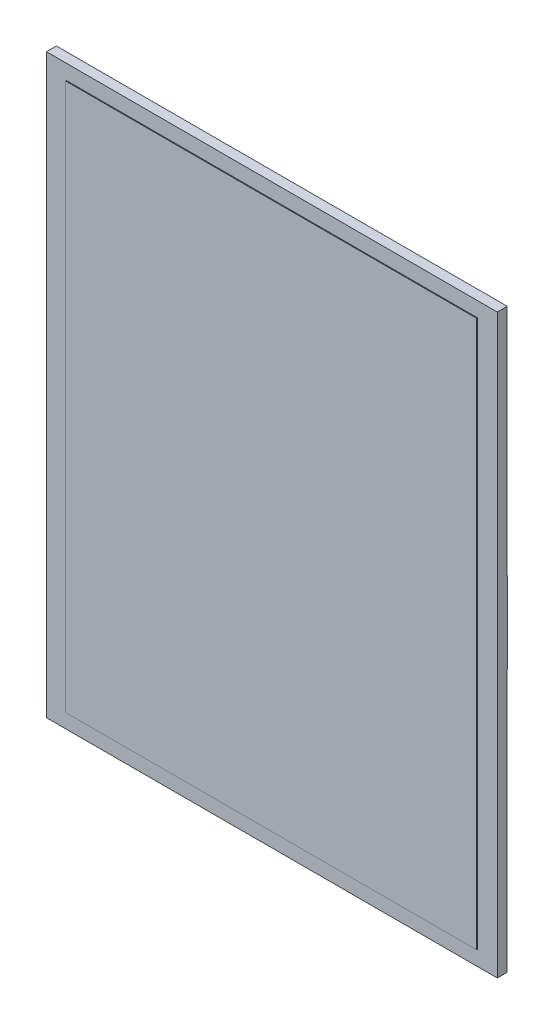
ISO-10303-21;
HEADER;
FILE_DESCRIPTION(('STEP AP214'),'2;1');
FILE_NAME('part.step','',(''),(''),'','','');
FILE_SCHEMA(('AUTOMOTIVE_DESIGN { 1 0 10303 214 1 1 1 1 }'));
ENDSEC;
DATA;
#1=APPLICATION_CONTEXT('core data for automotive mechanical design processes');
#2=APPLICATION_PROTOCOL_DEFINITION('international standard','automotive_design',2000,#1);
#3=PRODUCT_CONTEXT('',#1,'mechanical');
#4=PRODUCT('Part','Part','',(#3));
#5=PRODUCT_RELATED_PRODUCT_CATEGORY('part','',(#4));
#6=PRODUCT_DEFINITION_FORMATION('','',#4);
#7=PRODUCT_DEFINITION_CONTEXT('part definition',#1,'design');
#8=PRODUCT_DEFINITION('design','',#6,#7);
#9=PRODUCT_DEFINITION_SHAPE('','',#8);
#10=(LENGTH_UNIT() NAMED_UNIT(*) SI_UNIT(.MILLI.,.METRE.));
#11=(NAMED_UNIT(*) PLANE_ANGLE_UNIT() SI_UNIT($,.RADIAN.));
#12=(NAMED_UNIT(*) SI_UNIT($,.STERADIAN.) SOLID_ANGLE_UNIT());
#13=UNCERTAINTY_MEASURE_WITH_UNIT(LENGTH_MEASURE(1.E-05),#10,'distance_accuracy_value','');
#14=(GEOMETRIC_REPRESENTATION_CONTEXT(3) GLOBAL_UNCERTAINTY_ASSIGNED_CONTEXT((#13)) GLOBAL_UNIT_ASSIGNED_CONTEXT((#10,
#11,#12)) REPRESENTATION_CONTEXT('',''));
#15=CARTESIAN_POINT('',(0.,0.,0.));
#16=DIRECTION('',(0.,0.,1.));
#17=DIRECTION('',(1.,0.,0.));
#18=AXIS2_PLACEMENT_3D('',#15,#16,#17);
#19=CARTESIAN_POINT('',(0.,0.,3.));
#20=DIRECTION('',(0.,0.,-1.));
#21=DIRECTION('',(-1.,0.,0.));
#22=AXIS2_PLACEMENT_3D('',#19,#20,#21);
#23=PLANE('',#22);
#24=DIRECTION('',(0.,-1.,0.));
#25=VECTOR('',#24,1.);
#26=CARTESIAN_POINT('',(-68.,-87.,3.));
#27=LINE('',#26,#25);
#28=CARTESIAN_POINT('',(-68.,87.,3.));
#29=VERTEX_POINT('',#28);
#30=CARTESIAN_POINT('',(-68.,-87.,3.));
#31=VERTEX_POINT('',#30);
#32=EDGE_CURVE('E184',#29,#31,#27,.T.);
#33=ORIENTED_EDGE('',*,*,#32,.T.);
#34=DIRECTION('',(1.,0.,0.));
#35=VECTOR('',#34,1.);
#36=CARTESIAN_POINT('',(-68.,-87.,3.));
#37=LINE('',#36,#35);
#38=CARTESIAN_POINT('',(68.,-87.,3.));
#39=VERTEX_POINT('',#38);
#40=EDGE_CURVE('E187',#31,#39,#37,.T.);
#41=ORIENTED_EDGE('',*,*,#40,.T.);
#42=DIRECTION('',(0.,1.,0.));
#43=VECTOR('',#42,1.);
#44=CARTESIAN_POINT('',(68.,-87.,3.));
#45=LINE('',#44,#43);
#46=CARTESIAN_POINT('',(68.,87.,3.));
#47=VERTEX_POINT('',#46);
#48=EDGE_CURVE('E190',#39,#47,#45,.T.);
#49=ORIENTED_EDGE('',*,*,#48,.T.);
#50=DIRECTION('',(-1.,0.,0.));
#51=VECTOR('',#50,1.);
#52=CARTESIAN_POINT('',(-68.,87.,3.));
#53=LINE('',#52,#51);
#54=EDGE_CURVE('E192',#47,#29,#53,.T.);
#55=ORIENTED_EDGE('',*,*,#54,.T.);
#56=EDGE_LOOP('',(#33,#41,#49,#55));
#57=FACE_BOUND('',#56,.T.);
#58=DIRECTION('',(0.,-1.,0.));
#59=VECTOR('',#58,1.);
#60=CARTESIAN_POINT('',(-62.,-82.5,3.));
#61=LINE('',#60,#59);
#62=CARTESIAN_POINT('',(-62.,82.5,3.));
#63=VERTEX_POINT('',#62);
#64=CARTESIAN_POINT('',(-62.,-82.5,3.));
#65=VERTEX_POINT('',#64);
#66=EDGE_CURVE('E145',#63,#65,#61,.T.);
#67=ORIENTED_EDGE('',*,*,#66,.F.);
#68=DIRECTION('',(-1.,0.,0.));
#69=VECTOR('',#68,1.);
#70=CARTESIAN_POINT('',(-62.,82.5,3.));
#71=LINE('',#70,#69);
#72=CARTESIAN_POINT('',(62.,82.5,3.));
#73=VERTEX_POINT('',#72);
#74=EDGE_CURVE('E158',#73,#63,#71,.T.);
#75=ORIENTED_EDGE('',*,*,#74,.F.);
#76=DIRECTION('',(0.,1.,0.));
#77=VECTOR('',#76,1.);
#78=CARTESIAN_POINT('',(62.,-82.5,3.));
#79=LINE('',#78,#77);
#80=CARTESIAN_POINT('',(62.,-82.5,3.));
#81=VERTEX_POINT('',#80);
#82=EDGE_CURVE('E167',#81,#73,#79,.T.);
#83=ORIENTED_EDGE('',*,*,#82,.F.);
#84=DIRECTION('',(1.,0.,0.));
#85=VECTOR('',#84,1.);
#86=CARTESIAN_POINT('',(-62.,-82.5,3.));
#87=LINE('',#86,#85);
#88=EDGE_CURVE('E148',#65,#81,#87,.T.);
#89=ORIENTED_EDGE('',*,*,#88,.F.);
#90=EDGE_LOOP('',(#67,#75,#83,#89));
#91=FACE_BOUND('',#90,.T.);
#92=ADVANCED_FACE('F35',(#57,#91),#23,.F.);
#93=CARTESIAN_POINT('',(-68.,-87.,3.));
#94=DIRECTION('',(1.,0.,0.));
#95=DIRECTION('',(0.,0.,-1.));
#96=AXIS2_PLACEMENT_3D('',#93,#94,#95);
#97=PLANE('',#96);
#98=DIRECTION('',(0.,-1.,0.));
#99=VECTOR('',#98,1.);
#100=CARTESIAN_POINT('',(-68.,-87.,0.));
#101=LINE('',#100,#99);
#102=CARTESIAN_POINT('',(-68.,87.,0.));
#103=VERTEX_POINT('',#102);
#104=CARTESIAN_POINT('',(-68.,-87.,0.));
#105=VERTEX_POINT('',#104);
#106=EDGE_CURVE('E183',#103,#105,#101,.T.);
#107=ORIENTED_EDGE('',*,*,#106,.T.);
#108=DIRECTION('',(0.,0.,-1.));
#109=VECTOR('',#108,1.);
#110=CARTESIAN_POINT('',(-68.,-87.,3.));
#111=LINE('',#110,#109);
#112=EDGE_CURVE('E11',#31,#105,#111,.T.);
#113=ORIENTED_EDGE('',*,*,#112,.F.);
#114=ORIENTED_EDGE('',*,*,#32,.F.);
#115=DIRECTION('',(0.,0.,-1.));
#116=VECTOR('',#115,1.);
#117=CARTESIAN_POINT('',(-68.,87.,3.));
#118=LINE('',#117,#116);
#119=EDGE_CURVE('E194',#29,#103,#118,.T.);
#120=ORIENTED_EDGE('',*,*,#119,.T.);
#121=EDGE_LOOP('',(#107,#113,#114,#120));
#122=FACE_BOUND('',#121,.T.);
#123=ADVANCED_FACE('F37',(#122),#97,.F.);
#124=CARTESIAN_POINT('',(-68.,-87.,3.));
#125=DIRECTION('',(0.,1.,0.));
#126=DIRECTION('',(-1.,0.,0.));
#127=AXIS2_PLACEMENT_3D('',#124,#125,#126);
#128=PLANE('',#127);
#129=DIRECTION('',(1.,0.,0.));
#130=VECTOR('',#129,1.);
#131=CARTESIAN_POINT('',(-68.,-87.,0.));
#132=LINE('',#131,#130);
#133=CARTESIAN_POINT('',(68.,-87.,0.));
#134=VERTEX_POINT('',#133);
#135=EDGE_CURVE('E197',#105,#134,#132,.T.);
#136=ORIENTED_EDGE('',*,*,#135,.T.);
#137=DIRECTION('',(0.,0.,-1.));
#138=VECTOR('',#137,1.);
#139=CARTESIAN_POINT('',(68.,-87.,3.));
#140=LINE('',#139,#138);
#141=EDGE_CURVE('E43',#39,#134,#140,.T.);
#142=ORIENTED_EDGE('',*,*,#141,.F.);
#143=ORIENTED_EDGE('',*,*,#40,.F.);
#144=ORIENTED_EDGE('',*,*,#112,.T.);
#145=EDGE_LOOP('',(#136,#142,#143,#144));
#146=FACE_BOUND('',#145,.T.);
#147=ADVANCED_FACE('F244',(#146),#128,.F.);
#148=CARTESIAN_POINT('',(68.,-87.,3.));
#149=DIRECTION('',(-1.,0.,0.));
#150=DIRECTION('',(0.,-1.,0.));
#151=AXIS2_PLACEMENT_3D('',#148,#149,#150);
#152=PLANE('',#151);
#153=DIRECTION('',(0.,1.,0.));
#154=VECTOR('',#153,1.);
#155=CARTESIAN_POINT('',(68.,-87.,0.));
#156=LINE('',#155,#154);
#157=CARTESIAN_POINT('',(68.,-7.91722371205239,0.));
#158=VERTEX_POINT('',#157);
#159=EDGE_CURVE('E199',#134,#158,#156,.T.);
#160=ORIENTED_EDGE('',*,*,#159,.T.);
#161=DIRECTION('',(0.,0.,1.));
#162=VECTOR('',#161,1.);
#163=CARTESIAN_POINT('',(68.,-7.91722371205239,-0.1));
#164=LINE('',#163,#162);
#165=CARTESIAN_POINT('',(68.,-7.91722371205239,-0.1));
#166=VERTEX_POINT('',#165);
#167=EDGE_CURVE('E129',#166,#158,#164,.T.);
#168=ORIENTED_EDGE('',*,*,#167,.F.);
#169=DIRECTION('',(0.,-1.,0.));
#170=VECTOR('',#169,1.);
#171=CARTESIAN_POINT('',(68.,16.5832560277543,-0.1));
#172=LINE('',#171,#170);
#173=CARTESIAN_POINT('',(68.,16.5832560277543,-0.1));
#174=VERTEX_POINT('',#173);
#175=EDGE_CURVE('E122',#174,#166,#172,.T.);
#176=ORIENTED_EDGE('',*,*,#175,.F.);
#177=DIRECTION('',(0.,0.,1.));
#178=VECTOR('',#177,1.);
#179=CARTESIAN_POINT('',(68.,16.5832560277543,-0.1));
#180=LINE('',#179,#178);
#181=CARTESIAN_POINT('',(68.,16.5832560277543,0.));
#182=VERTEX_POINT('',#181);
#183=EDGE_CURVE('E127',#174,#182,#180,.T.);
#184=ORIENTED_EDGE('',*,*,#183,.T.);
#185=CARTESIAN_POINT('',(68.,87.,0.));
#186=VERTEX_POINT('',#185);
#187=EDGE_CURVE('E55',#182,#186,#156,.T.);
#188=ORIENTED_EDGE('',*,*,#187,.T.);
#189=DIRECTION('',(0.,0.,-1.));
#190=VECTOR('',#189,1.);
#191=CARTESIAN_POINT('',(68.,87.,3.));
#192=LINE('',#191,#190);
#193=EDGE_CURVE('E204',#47,#186,#192,.T.);
#194=ORIENTED_EDGE('',*,*,#193,.F.);
#195=ORIENTED_EDGE('',*,*,#48,.F.);
#196=ORIENTED_EDGE('',*,*,#141,.T.);
#197=EDGE_LOOP('',(#160,#168,#176,#184,#188,#194,#195,#196));
#198=FACE_BOUND('',#197,.T.);
#199=ADVANCED_FACE('F125',(#198),#152,.F.);
#200=CARTESIAN_POINT('',(-68.,87.,3.));
#201=DIRECTION('',(0.,-1.,0.));
#202=DIRECTION('',(0.,0.,-1.));
#203=AXIS2_PLACEMENT_3D('',#200,#201,#202);
#204=PLANE('',#203);
#205=DIRECTION('',(-1.,0.,0.));
#206=VECTOR('',#205,1.);
#207=CARTESIAN_POINT('',(-68.,87.,0.));
#208=LINE('',#207,#206);
#209=EDGE_CURVE('E188',#186,#103,#208,.T.);
#210=ORIENTED_EDGE('',*,*,#209,.T.);
#211=ORIENTED_EDGE('',*,*,#119,.F.);
#212=ORIENTED_EDGE('',*,*,#54,.F.);
#213=ORIENTED_EDGE('',*,*,#193,.T.);
#214=EDGE_LOOP('',(#210,#211,#212,#213));
#215=FACE_BOUND('',#214,.T.);
#216=ADVANCED_FACE('F253',(#215),#204,.F.);
#217=CARTESIAN_POINT('',(0.,0.,0.));
#218=DIRECTION('',(0.,0.,-1.));
#219=DIRECTION('',(-1.,0.,0.));
#220=AXIS2_PLACEMENT_3D('',#217,#218,#219);
#221=PLANE('',#220);
#222=DIRECTION('',(1.,0.,0.));
#223=VECTOR('',#222,1.);
#224=CARTESIAN_POINT('',(68.,16.5832560277543,0.));
#225=LINE('',#224,#223);
#226=CARTESIAN_POINT('',(49.8446174767082,16.5832560277543,0.));
#227=VERTEX_POINT('',#226);
#228=EDGE_CURVE('E50',#227,#182,#225,.T.);
#229=ORIENTED_EDGE('',*,*,#228,.F.);
#230=DIRECTION('',(0.,1.,0.));
#231=VECTOR('',#230,1.);
#232=CARTESIAN_POINT('',(49.8446174767082,16.5832560277543,0.));
#233=LINE('',#232,#231);
#234=CARTESIAN_POINT('',(49.8446174767082,-7.91722371205239,0.));
#235=VERTEX_POINT('',#234);
#236=EDGE_CURVE('E142',#235,#227,#233,.T.);
#237=ORIENTED_EDGE('',*,*,#236,.F.);
#238=DIRECTION('',(-1.,0.,0.));
#239=VECTOR('',#238,1.);
#240=CARTESIAN_POINT('',(68.,-7.91722371205239,0.));
#241=LINE('',#240,#239);
#242=EDGE_CURVE('E215',#158,#235,#241,.T.);
#243=ORIENTED_EDGE('',*,*,#242,.F.);
#244=ORIENTED_EDGE('',*,*,#159,.F.);
#245=ORIENTED_EDGE('',*,*,#135,.F.);
#246=ORIENTED_EDGE('',*,*,#106,.F.);
#247=ORIENTED_EDGE('',*,*,#209,.F.);
#248=ORIENTED_EDGE('',*,*,#187,.F.);
#249=EDGE_LOOP('',(#229,#237,#243,#244,#245,#246,#247,#248));
#250=FACE_BOUND('',#249,.T.);
#251=ADVANCED_FACE('F212',(#250),#221,.T.);
#252=CARTESIAN_POINT('',(-62.,-82.5,3.25));
#253=DIRECTION('',(1.,0.,0.));
#254=DIRECTION('',(0.,1.,0.));
#255=AXIS2_PLACEMENT_3D('',#252,#253,#254);
#256=PLANE('',#255);
#257=ORIENTED_EDGE('',*,*,#66,.T.);
#258=DIRECTION('',(0.,0.,-1.));
#259=VECTOR('',#258,1.);
#260=CARTESIAN_POINT('',(-62.,-82.5,3.25));
#261=LINE('',#260,#259);
#262=CARTESIAN_POINT('',(-62.,-82.5,3.25));
#263=VERTEX_POINT('',#262);
#264=EDGE_CURVE('E180',#263,#65,#261,.T.);
#265=ORIENTED_EDGE('',*,*,#264,.F.);
#266=DIRECTION('',(0.,-1.,0.));
#267=VECTOR('',#266,1.);
#268=CARTESIAN_POINT('',(-62.,-82.5,3.25));
#269=LINE('',#268,#267);
#270=CARTESIAN_POINT('',(-62.,82.5,3.25));
#271=VERTEX_POINT('',#270);
#272=EDGE_CURVE('E154',#271,#263,#269,.T.);
#273=ORIENTED_EDGE('',*,*,#272,.F.);
#274=DIRECTION('',(0.,0.,-1.));
#275=VECTOR('',#274,1.);
#276=CARTESIAN_POINT('',(-62.,82.5,3.25));
#277=LINE('',#276,#275);
#278=EDGE_CURVE('E163',#271,#63,#277,.T.);
#279=ORIENTED_EDGE('',*,*,#278,.T.);
#280=EDGE_LOOP('',(#257,#265,#273,#279));
#281=FACE_BOUND('',#280,.T.);
#282=ADVANCED_FACE('F249',(#281),#256,.F.);
#283=CARTESIAN_POINT('',(-62.,-82.5,3.25));
#284=DIRECTION('',(0.,1.,0.));
#285=DIRECTION('',(0.,0.,1.));
#286=AXIS2_PLACEMENT_3D('',#283,#284,#285);
#287=PLANE('',#286);
#288=ORIENTED_EDGE('',*,*,#88,.T.);
#289=DIRECTION('',(0.,0.,-1.));
#290=VECTOR('',#289,1.);
#291=CARTESIAN_POINT('',(62.,-82.5,3.25));
#292=LINE('',#291,#290);
#293=CARTESIAN_POINT('',(62.,-82.5,3.25));
#294=VERTEX_POINT('',#293);
#295=EDGE_CURVE('E177',#294,#81,#292,.T.);
#296=ORIENTED_EDGE('',*,*,#295,.F.);
#297=DIRECTION('',(1.,0.,0.));
#298=VECTOR('',#297,1.);
#299=CARTESIAN_POINT('',(-62.,-82.5,3.25));
#300=LINE('',#299,#298);
#301=EDGE_CURVE('E157',#263,#294,#300,.T.);
#302=ORIENTED_EDGE('',*,*,#301,.F.);
#303=ORIENTED_EDGE('',*,*,#264,.T.);
#304=EDGE_LOOP('',(#288,#296,#302,#303));
#305=FACE_BOUND('',#304,.T.);
#306=ADVANCED_FACE('F286',(#305),#287,.F.);
#307=CARTESIAN_POINT('',(62.,-82.5,3.25));
#308=DIRECTION('',(-1.,0.,0.));
#309=DIRECTION('',(0.,-1.,0.));
#310=AXIS2_PLACEMENT_3D('',#307,#308,#309);
#311=PLANE('',#310);
#312=ORIENTED_EDGE('',*,*,#82,.T.);
#313=DIRECTION('',(0.,0.,-1.));
#314=VECTOR('',#313,1.);
#315=CARTESIAN_POINT('',(62.,82.5,3.25));
#316=LINE('',#315,#314);
#317=CARTESIAN_POINT('',(62.,82.5,3.25));
#318=VERTEX_POINT('',#317);
#319=EDGE_CURVE('E174',#318,#73,#316,.T.);
#320=ORIENTED_EDGE('',*,*,#319,.F.);
#321=DIRECTION('',(0.,1.,0.));
#322=VECTOR('',#321,1.);
#323=CARTESIAN_POINT('',(62.,-82.5,3.25));
#324=LINE('',#323,#322);
#325=EDGE_CURVE('E160',#294,#318,#324,.T.);
#326=ORIENTED_EDGE('',*,*,#325,.F.);
#327=ORIENTED_EDGE('',*,*,#295,.T.);
#328=EDGE_LOOP('',(#312,#320,#326,#327));
#329=FACE_BOUND('',#328,.T.);
#330=ADVANCED_FACE('F293',(#329),#311,.F.);
#331=CARTESIAN_POINT('',(-62.,82.5,3.25));
#332=DIRECTION('',(0.,-1.,0.));
#333=DIRECTION('',(1.,0.,0.));
#334=AXIS2_PLACEMENT_3D('',#331,#332,#333);
#335=PLANE('',#334);
#336=ORIENTED_EDGE('',*,*,#74,.T.);
#337=ORIENTED_EDGE('',*,*,#278,.F.);
#338=DIRECTION('',(-1.,0.,0.));
#339=VECTOR('',#338,1.);
#340=CARTESIAN_POINT('',(-62.,82.5,3.25));
#341=LINE('',#340,#339);
#342=EDGE_CURVE('E162',#318,#271,#341,.T.);
#343=ORIENTED_EDGE('',*,*,#342,.F.);
#344=ORIENTED_EDGE('',*,*,#319,.T.);
#345=EDGE_LOOP('',(#336,#337,#343,#344));
#346=FACE_BOUND('',#345,.T.);
#347=ADVANCED_FACE('F300',(#346),#335,.F.);
#348=CARTESIAN_POINT('',(0.,0.,3.25));
#349=DIRECTION('',(0.,0.,-1.));
#350=DIRECTION('',(-1.,0.,0.));
#351=AXIS2_PLACEMENT_3D('',#348,#349,#350);
#352=PLANE('',#351);
#353=ORIENTED_EDGE('',*,*,#272,.T.);
#354=ORIENTED_EDGE('',*,*,#301,.T.);
#355=ORIENTED_EDGE('',*,*,#325,.T.);
#356=ORIENTED_EDGE('',*,*,#342,.T.);
#357=EDGE_LOOP('',(#353,#354,#355,#356));
#358=FACE_BOUND('',#357,.T.);
#359=ADVANCED_FACE('F236',(#358),#352,.F.);
#360=CARTESIAN_POINT('',(68.,16.5832560277543,-0.1));
#361=DIRECTION('',(0.,-1.,0.));
#362=DIRECTION('',(0.,0.,-1.));
#363=AXIS2_PLACEMENT_3D('',#360,#361,#362);
#364=PLANE('',#363);
#365=ORIENTED_EDGE('',*,*,#228,.T.);
#366=ORIENTED_EDGE('',*,*,#183,.F.);
#367=DIRECTION('',(1.,0.,0.));
#368=VECTOR('',#367,1.);
#369=CARTESIAN_POINT('',(68.,16.5832560277543,-0.1));
#370=LINE('',#369,#368);
#371=CARTESIAN_POINT('',(49.8446174767082,16.5832560277543,-0.1));
#372=VERTEX_POINT('',#371);
#373=EDGE_CURVE('E133',#372,#174,#370,.T.);
#374=ORIENTED_EDGE('',*,*,#373,.F.);
#375=DIRECTION('',(0.,0.,1.));
#376=VECTOR('',#375,1.);
#377=CARTESIAN_POINT('',(49.8446174767082,16.5832560277543,-0.1));
#378=LINE('',#377,#376);
#379=EDGE_CURVE('E224',#372,#227,#378,.T.);
#380=ORIENTED_EDGE('',*,*,#379,.T.);
#381=EDGE_LOOP('',(#365,#366,#374,#380));
#382=FACE_BOUND('',#381,.T.);
#383=ADVANCED_FACE('F144',(#382),#364,.F.);
#384=CARTESIAN_POINT('',(68.,-7.91722371205239,-0.1));
#385=DIRECTION('',(0.,1.,0.));
#386=DIRECTION('',(0.,0.,1.));
#387=AXIS2_PLACEMENT_3D('',#384,#385,#386);
#388=PLANE('',#387);
#389=ORIENTED_EDGE('',*,*,#242,.T.);
#390=DIRECTION('',(0.,0.,1.));
#391=VECTOR('',#390,1.);
#392=CARTESIAN_POINT('',(49.8446174767082,-7.91722371205239,-0.1));
#393=LINE('',#392,#391);
#394=CARTESIAN_POINT('',(49.8446174767082,-7.91722371205239,-0.1));
#395=VERTEX_POINT('',#394);
#396=EDGE_CURVE('E150',#395,#235,#393,.T.);
#397=ORIENTED_EDGE('',*,*,#396,.F.);
#398=DIRECTION('',(-1.,0.,0.));
#399=VECTOR('',#398,1.);
#400=CARTESIAN_POINT('',(68.,-7.91722371205239,-0.1));
#401=LINE('',#400,#399);
#402=EDGE_CURVE('E132',#166,#395,#401,.T.);
#403=ORIENTED_EDGE('',*,*,#402,.F.);
#404=ORIENTED_EDGE('',*,*,#167,.T.);
#405=EDGE_LOOP('',(#389,#397,#403,#404));
#406=FACE_BOUND('',#405,.T.);
#407=ADVANCED_FACE('F227',(#406),#388,.F.);
#408=CARTESIAN_POINT('',(49.8446174767082,16.5832560277543,-0.1));
#409=DIRECTION('',(1.,0.,0.));
#410=DIRECTION('',(0.,1.,0.));
#411=AXIS2_PLACEMENT_3D('',#408,#409,#410);
#412=PLANE('',#411);
#413=ORIENTED_EDGE('',*,*,#236,.T.);
#414=ORIENTED_EDGE('',*,*,#379,.F.);
#415=DIRECTION('',(0.,1.,0.));
#416=VECTOR('',#415,1.);
#417=CARTESIAN_POINT('',(49.8446174767082,16.5832560277543,-0.1));
#418=LINE('',#417,#416);
#419=EDGE_CURVE('E138',#395,#372,#418,.T.);
#420=ORIENTED_EDGE('',*,*,#419,.F.);
#421=ORIENTED_EDGE('',*,*,#396,.T.);
#422=EDGE_LOOP('',(#413,#414,#420,#421));
#423=FACE_BOUND('',#422,.T.);
#424=ADVANCED_FACE('F226',(#423),#412,.F.);
#425=CARTESIAN_POINT('',(0.,0.,-0.1));
#426=DIRECTION('',(0.,0.,1.));
#427=DIRECTION('',(1.,0.,0.));
#428=AXIS2_PLACEMENT_3D('',#425,#426,#427);
#429=PLANE('',#428);
#430=ORIENTED_EDGE('',*,*,#373,.T.);
#431=ORIENTED_EDGE('',*,*,#175,.T.);
#432=ORIENTED_EDGE('',*,*,#402,.T.);
#433=ORIENTED_EDGE('',*,*,#419,.T.);
#434=EDGE_LOOP('',(#430,#431,#432,#433));
#435=FACE_BOUND('',#434,.T.);
#436=ADVANCED_FACE('F136',(#435),#429,.F.);
#437=CLOSED_SHELL('',(#92,#123,#147,#199,#216,#251,#282,#306,#330,#347,#359,#383,#407,#424,#436));
#438=MANIFOLD_SOLID_BREP('B2',#437);
#439=ADVANCED_BREP_SHAPE_REPRESENTATION('',(#18,#438),#14);
#440=SHAPE_DEFINITION_REPRESENTATION(#9,#439);
ENDSEC;
END-ISO-10303-21;
